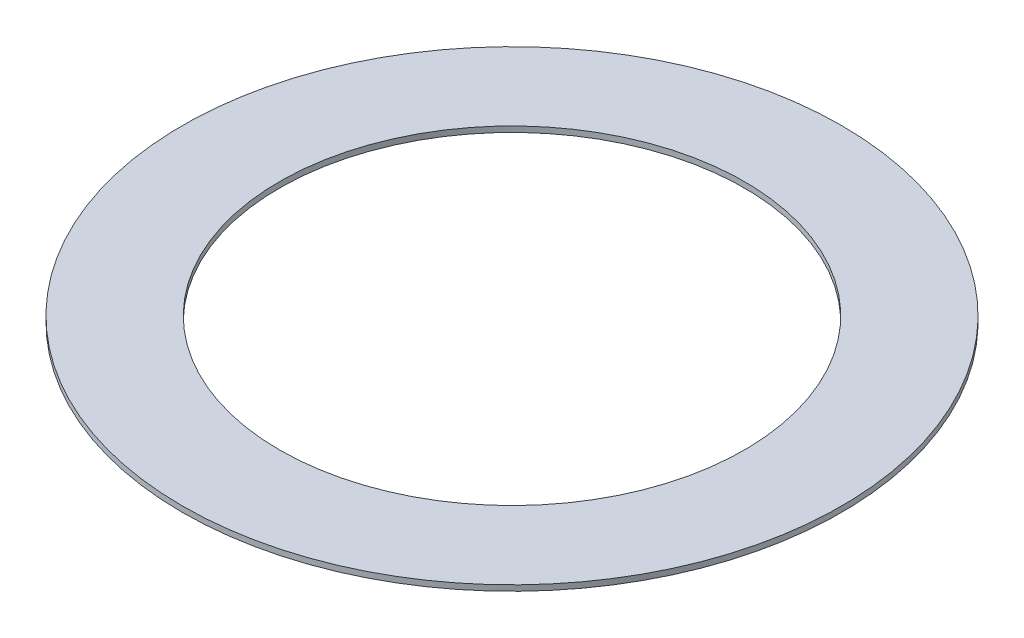
ISO-10303-21;
HEADER;
FILE_DESCRIPTION(('STEP AP214'),'2;1');
FILE_NAME('part.step','',(''),(''),'','','');
FILE_SCHEMA(('AUTOMOTIVE_DESIGN { 1 0 10303 214 1 1 1 1 }'));
ENDSEC;
DATA;
#1=APPLICATION_CONTEXT('core data for automotive mechanical design processes');
#2=APPLICATION_PROTOCOL_DEFINITION('international standard','automotive_design',2000,#1);
#3=PRODUCT_CONTEXT('',#1,'mechanical');
#4=PRODUCT('Part','Part','',(#3));
#5=PRODUCT_RELATED_PRODUCT_CATEGORY('part','',(#4));
#6=PRODUCT_DEFINITION_FORMATION('','',#4);
#7=PRODUCT_DEFINITION_CONTEXT('part definition',#1,'design');
#8=PRODUCT_DEFINITION('design','',#6,#7);
#9=PRODUCT_DEFINITION_SHAPE('','',#8);
#10=(LENGTH_UNIT() NAMED_UNIT(*) SI_UNIT(.MILLI.,.METRE.));
#11=(NAMED_UNIT(*) PLANE_ANGLE_UNIT() SI_UNIT($,.RADIAN.));
#12=(NAMED_UNIT(*) SI_UNIT($,.STERADIAN.) SOLID_ANGLE_UNIT());
#13=UNCERTAINTY_MEASURE_WITH_UNIT(LENGTH_MEASURE(1.E-05),#10,'distance_accuracy_value','');
#14=(GEOMETRIC_REPRESENTATION_CONTEXT(3) GLOBAL_UNCERTAINTY_ASSIGNED_CONTEXT((#13)) GLOBAL_UNIT_ASSIGNED_CONTEXT((#10,
#11,#12)) REPRESENTATION_CONTEXT('',''));
#15=CARTESIAN_POINT('',(0.,0.,0.));
#16=DIRECTION('',(0.,0.,1.));
#17=DIRECTION('',(1.,0.,0.));
#18=AXIS2_PLACEMENT_3D('',#15,#16,#17);
#19=CARTESIAN_POINT('',(0.,3.,0.));
#20=DIRECTION('',(0.,1.,0.));
#21=DIRECTION('',(0.,0.,1.));
#22=AXIS2_PLACEMENT_3D('',#19,#20,#21);
#23=PLANE('',#22);
#24=CARTESIAN_POINT('',(0.,3.,0.));
#25=DIRECTION('',(0.,1.,0.));
#26=DIRECTION('',(0.,0.,1.));
#27=AXIS2_PLACEMENT_3D('',#24,#25,#26);
#28=CIRCLE('',#27,175.920811822068);
#29=CARTESIAN_POINT('',(0.,3.,175.920811822068));
#30=VERTEX_POINT('',#29);
#31=EDGE_CURVE('E10',#30,#30,#28,.T.);
#32=ORIENTED_EDGE('',*,*,#31,.T.);
#33=EDGE_LOOP('',(#32));
#34=FACE_BOUND('',#33,.T.);
#35=CARTESIAN_POINT('',(0.,3.,0.));
#36=DIRECTION('',(0.,1.,0.));
#37=DIRECTION('',(0.,0.,1.));
#38=AXIS2_PLACEMENT_3D('',#35,#36,#37);
#39=CIRCLE('',#38,124.09199797316);
#40=CARTESIAN_POINT('',(0.,3.,124.09199797316));
#41=VERTEX_POINT('',#40);
#42=EDGE_CURVE('E44',#41,#41,#39,.T.);
#43=ORIENTED_EDGE('',*,*,#42,.F.);
#44=EDGE_LOOP('',(#43));
#45=FACE_BOUND('',#44,.T.);
#46=ADVANCED_FACE('F33',(#34,#45),#23,.T.);
#47=CARTESIAN_POINT('',(0.,0.,0.));
#48=DIRECTION('',(0.,1.,0.));
#49=DIRECTION('',(0.,0.,1.));
#50=AXIS2_PLACEMENT_3D('',#47,#48,#49);
#51=PLANE('',#50);
#52=CARTESIAN_POINT('',(0.,0.,0.));
#53=DIRECTION('',(0.,1.,0.));
#54=DIRECTION('',(0.,0.,1.));
#55=AXIS2_PLACEMENT_3D('',#52,#53,#54);
#56=CIRCLE('',#55,175.920811822068);
#57=CARTESIAN_POINT('',(0.,0.,175.920811822068));
#58=VERTEX_POINT('',#57);
#59=EDGE_CURVE('E37',#58,#58,#56,.T.);
#60=ORIENTED_EDGE('',*,*,#59,.F.);
#61=EDGE_LOOP('',(#60));
#62=FACE_BOUND('',#61,.T.);
#63=CARTESIAN_POINT('',(0.,0.,0.));
#64=DIRECTION('',(0.,1.,0.));
#65=DIRECTION('',(0.,0.,1.));
#66=AXIS2_PLACEMENT_3D('',#63,#64,#65);
#67=CIRCLE('',#66,124.09199797316);
#68=CARTESIAN_POINT('',(0.,0.,124.09199797316));
#69=VERTEX_POINT('',#68);
#70=EDGE_CURVE('E46',#69,#69,#67,.T.);
#71=ORIENTED_EDGE('',*,*,#70,.T.);
#72=EDGE_LOOP('',(#71));
#73=FACE_BOUND('',#72,.T.);
#74=ADVANCED_FACE('F57',(#62,#73),#51,.F.);
#75=CARTESIAN_POINT('',(0.,3.,0.));
#76=DIRECTION('',(0.,-1.,0.));
#77=DIRECTION('',(0.,0.,-1.));
#78=AXIS2_PLACEMENT_3D('',#75,#76,#77);
#79=CYLINDRICAL_SURFACE('',#78,175.920811822068);
#80=ORIENTED_EDGE('',*,*,#31,.F.);
#81=EDGE_LOOP('',(#80));
#82=FACE_BOUND('',#81,.T.);
#83=ORIENTED_EDGE('',*,*,#59,.T.);
#84=EDGE_LOOP('',(#83));
#85=FACE_BOUND('',#84,.T.);
#86=ADVANCED_FACE('F35',(#82,#85),#79,.T.);
#87=CARTESIAN_POINT('',(0.,3.,0.));
#88=DIRECTION('',(0.,-1.,0.));
#89=DIRECTION('',(0.,0.,-1.));
#90=AXIS2_PLACEMENT_3D('',#87,#88,#89);
#91=CYLINDRICAL_SURFACE('',#90,124.09199797316);
#92=ORIENTED_EDGE('',*,*,#42,.T.);
#93=EDGE_LOOP('',(#92));
#94=FACE_BOUND('',#93,.T.);
#95=ORIENTED_EDGE('',*,*,#70,.F.);
#96=EDGE_LOOP('',(#95));
#97=FACE_BOUND('',#96,.T.);
#98=ADVANCED_FACE('F53',(#94,#97),#91,.F.);
#99=CLOSED_SHELL('',(#46,#74,#86,#98));
#100=MANIFOLD_SOLID_BREP('B2',#99);
#101=ADVANCED_BREP_SHAPE_REPRESENTATION('',(#18,#100),#14);
#102=SHAPE_DEFINITION_REPRESENTATION(#9,#101);
ENDSEC;
END-ISO-10303-21;
